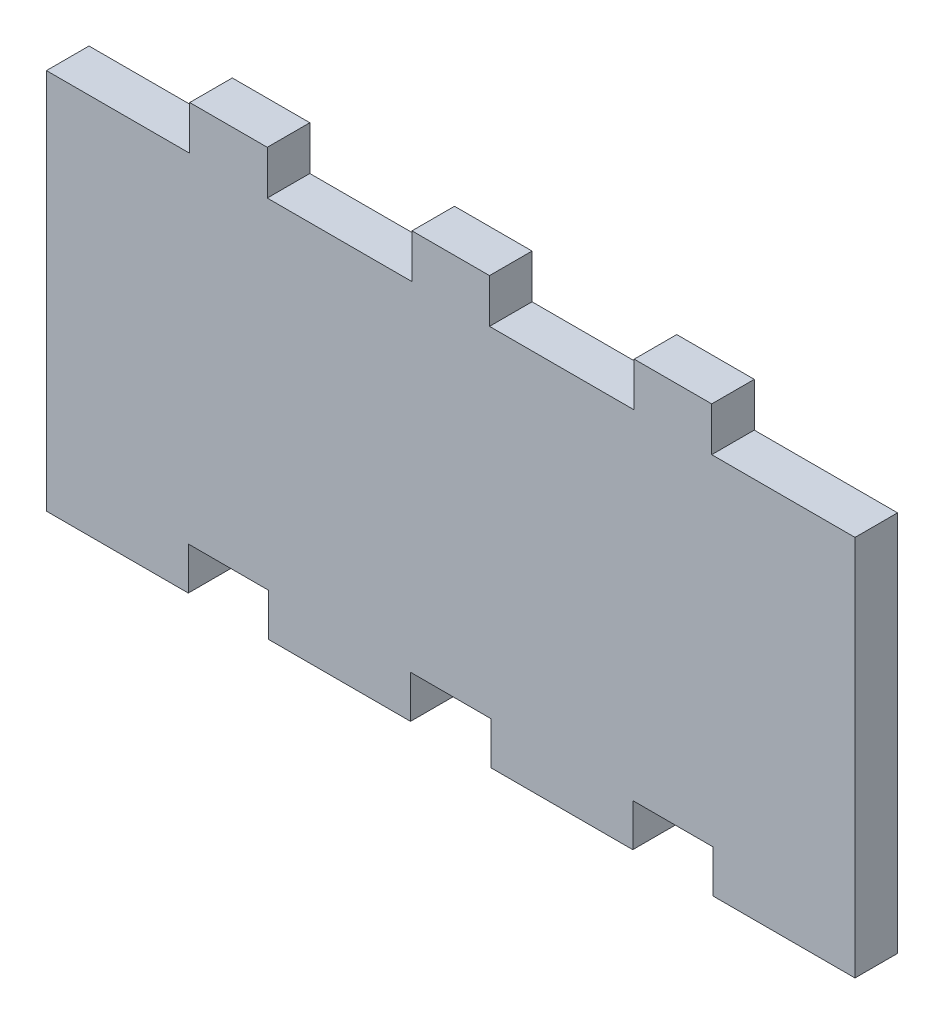
ISO-10303-21;
HEADER;
FILE_DESCRIPTION(('STEP AP214'),'2;1');
FILE_NAME('part.step','',(''),(''),'','','');
FILE_SCHEMA(('AUTOMOTIVE_DESIGN { 1 0 10303 214 1 1 1 1 }'));
ENDSEC;
DATA;
#1=APPLICATION_CONTEXT('core data for automotive mechanical design processes');
#2=APPLICATION_PROTOCOL_DEFINITION('international standard','automotive_design',2000,#1);
#3=PRODUCT_CONTEXT('',#1,'mechanical');
#4=PRODUCT('Part','Part','',(#3));
#5=PRODUCT_RELATED_PRODUCT_CATEGORY('part','',(#4));
#6=PRODUCT_DEFINITION_FORMATION('','',#4);
#7=PRODUCT_DEFINITION_CONTEXT('part definition',#1,'design');
#8=PRODUCT_DEFINITION('design','',#6,#7);
#9=PRODUCT_DEFINITION_SHAPE('','',#8);
#10=(LENGTH_UNIT() NAMED_UNIT(*) SI_UNIT(.MILLI.,.METRE.));
#11=(NAMED_UNIT(*) PLANE_ANGLE_UNIT() SI_UNIT($,.RADIAN.));
#12=(NAMED_UNIT(*) SI_UNIT($,.STERADIAN.) SOLID_ANGLE_UNIT());
#13=UNCERTAINTY_MEASURE_WITH_UNIT(LENGTH_MEASURE(1.E-05),#10,'distance_accuracy_value','');
#14=(GEOMETRIC_REPRESENTATION_CONTEXT(3) GLOBAL_UNCERTAINTY_ASSIGNED_CONTEXT((#13)) GLOBAL_UNIT_ASSIGNED_CONTEXT((#10,
#11,#12)) REPRESENTATION_CONTEXT('',''));
#15=CARTESIAN_POINT('',(0.,0.,0.));
#16=DIRECTION('',(0.,0.,1.));
#17=DIRECTION('',(1.,0.,0.));
#18=AXIS2_PLACEMENT_3D('',#15,#16,#17);
#19=CARTESIAN_POINT('',(0.,0.,-3.));
#20=DIRECTION('',(-1.,0.,0.));
#21=DIRECTION('',(0.,0.,1.));
#22=AXIS2_PLACEMENT_3D('',#19,#20,#21);
#23=PLANE('',#22);
#24=DIRECTION('',(0.,-1.,0.));
#25=VECTOR('',#24,1.);
#26=CARTESIAN_POINT('',(0.,0.,0.));
#27=LINE('',#26,#25);
#28=CARTESIAN_POINT('',(0.,23.9000000000001,0.));
#29=VERTEX_POINT('',#28);
#30=CARTESIAN_POINT('',(0.,-3.00000000000012,0.));
#31=VERTEX_POINT('',#30);
#32=EDGE_CURVE('E488',#29,#31,#27,.T.);
#33=ORIENTED_EDGE('',*,*,#32,.F.);
#34=DIRECTION('',(0.,0.,-1.));
#35=VECTOR('',#34,1.);
#36=CARTESIAN_POINT('',(0.,23.9000000000001,-3.));
#37=LINE('',#36,#35);
#38=CARTESIAN_POINT('',(0.,23.9000000000001,-3.));
#39=VERTEX_POINT('',#38);
#40=EDGE_CURVE('E277',#29,#39,#37,.T.);
#41=ORIENTED_EDGE('',*,*,#40,.T.);
#42=DIRECTION('',(0.,-1.,0.));
#43=VECTOR('',#42,1.);
#44=CARTESIAN_POINT('',(0.,0.,-3.));
#45=LINE('',#44,#43);
#46=CARTESIAN_POINT('',(0.,-3.00000000000013,-3.));
#47=VERTEX_POINT('',#46);
#48=EDGE_CURVE('E502',#39,#47,#45,.T.);
#49=ORIENTED_EDGE('',*,*,#48,.T.);
#50=DIRECTION('',(0.,0.,-1.));
#51=VECTOR('',#50,1.);
#52=CARTESIAN_POINT('',(0.,-3.00000000000012,0.));
#53=LINE('',#52,#51);
#54=EDGE_CURVE('E376',#31,#47,#53,.T.);
#55=ORIENTED_EDGE('',*,*,#54,.F.);
#56=EDGE_LOOP('',(#33,#41,#49,#55));
#57=FACE_BOUND('',#56,.T.);
#58=ADVANCED_FACE('F74',(#57),#23,.T.);
#59=CARTESIAN_POINT('',(0.,27.,-3.));
#60=DIRECTION('',(0.,1.,0.));
#61=DIRECTION('',(0.,0.,1.));
#62=AXIS2_PLACEMENT_3D('',#59,#60,#61);
#63=PLANE('',#62);
#64=DIRECTION('',(-1.,0.,0.));
#65=VECTOR('',#64,1.);
#66=CARTESIAN_POINT('',(0.,27.,0.));
#67=LINE('',#66,#65);
#68=CARTESIAN_POINT('',(46.9000000000004,27.,0.));
#69=VERTEX_POINT('',#68);
#70=CARTESIAN_POINT('',(41.4333333333337,27.,0.));
#71=VERTEX_POINT('',#70);
#72=EDGE_CURVE('E505',#69,#71,#67,.T.);
#73=ORIENTED_EDGE('',*,*,#72,.F.);
#74=DIRECTION('',(0.,0.,-1.));
#75=VECTOR('',#74,1.);
#76=CARTESIAN_POINT('',(46.9000000000004,27.,-3.));
#77=LINE('',#76,#75);
#78=CARTESIAN_POINT('',(46.9000000000004,27.,-3.));
#79=VERTEX_POINT('',#78);
#80=EDGE_CURVE('E367',#69,#79,#77,.T.);
#81=ORIENTED_EDGE('',*,*,#80,.T.);
#82=DIRECTION('',(-1.,0.,0.));
#83=VECTOR('',#82,1.);
#84=CARTESIAN_POINT('',(0.,27.,-3.));
#85=LINE('',#84,#83);
#86=CARTESIAN_POINT('',(41.4333333333337,27.,-3.));
#87=VERTEX_POINT('',#86);
#88=EDGE_CURVE('E276',#79,#87,#85,.T.);
#89=ORIENTED_EDGE('',*,*,#88,.T.);
#90=DIRECTION('',(0.,0.,1.));
#91=VECTOR('',#90,1.);
#92=CARTESIAN_POINT('',(41.4333333333337,27.,-3.));
#93=LINE('',#92,#91);
#94=EDGE_CURVE('E360',#87,#71,#93,.T.);
#95=ORIENTED_EDGE('',*,*,#94,.T.);
#96=EDGE_LOOP('',(#73,#81,#89,#95));
#97=FACE_BOUND('',#96,.T.);
#98=ADVANCED_FACE('F539',(#97),#63,.T.);
#99=CARTESIAN_POINT('',(31.2333333333337,27.,0.));
#100=VERTEX_POINT('',#99);
#101=CARTESIAN_POINT('',(25.7666666666671,27.,0.));
#102=VERTEX_POINT('',#101);
#103=EDGE_CURVE('E526',#100,#102,#67,.T.);
#104=ORIENTED_EDGE('',*,*,#103,.F.);
#105=DIRECTION('',(0.,0.,-1.));
#106=VECTOR('',#105,1.);
#107=CARTESIAN_POINT('',(31.2333333333337,27.,-3.));
#108=LINE('',#107,#106);
#109=CARTESIAN_POINT('',(31.2333333333337,27.,-3.));
#110=VERTEX_POINT('',#109);
#111=EDGE_CURVE('E363',#100,#110,#108,.T.);
#112=ORIENTED_EDGE('',*,*,#111,.T.);
#113=CARTESIAN_POINT('',(25.7666666666671,27.,-3.));
#114=VERTEX_POINT('',#113);
#115=EDGE_CURVE('E514',#110,#114,#85,.T.);
#116=ORIENTED_EDGE('',*,*,#115,.T.);
#117=DIRECTION('',(0.,0.,1.));
#118=VECTOR('',#117,1.);
#119=CARTESIAN_POINT('',(25.7666666666671,27.,-3.));
#120=LINE('',#119,#118);
#121=EDGE_CURVE('E354',#114,#102,#120,.T.);
#122=ORIENTED_EDGE('',*,*,#121,.T.);
#123=EDGE_LOOP('',(#104,#112,#116,#122));
#124=FACE_BOUND('',#123,.T.);
#125=ADVANCED_FACE('F545',(#124),#63,.T.);
#126=CARTESIAN_POINT('',(15.5666666666671,27.,0.));
#127=VERTEX_POINT('',#126);
#128=CARTESIAN_POINT('',(10.1000000000004,27.,0.));
#129=VERTEX_POINT('',#128);
#130=EDGE_CURVE('E523',#127,#129,#67,.T.);
#131=ORIENTED_EDGE('',*,*,#130,.F.);
#132=DIRECTION('',(0.,0.,-1.));
#133=VECTOR('',#132,1.);
#134=CARTESIAN_POINT('',(15.5666666666671,27.,-3.));
#135=LINE('',#134,#133);
#136=CARTESIAN_POINT('',(15.5666666666671,27.,-3.));
#137=VERTEX_POINT('',#136);
#138=EDGE_CURVE('E357',#127,#137,#135,.T.);
#139=ORIENTED_EDGE('',*,*,#138,.T.);
#140=CARTESIAN_POINT('',(10.1000000000004,27.,-3.));
#141=VERTEX_POINT('',#140);
#142=EDGE_CURVE('E511',#137,#141,#85,.T.);
#143=ORIENTED_EDGE('',*,*,#142,.T.);
#144=DIRECTION('',(0.,0.,1.));
#145=VECTOR('',#144,1.);
#146=CARTESIAN_POINT('',(10.1000000000004,27.,-3.));
#147=LINE('',#146,#145);
#148=EDGE_CURVE('E280',#141,#129,#147,.T.);
#149=ORIENTED_EDGE('',*,*,#148,.T.);
#150=EDGE_LOOP('',(#131,#139,#143,#149));
#151=FACE_BOUND('',#150,.T.);
#152=ADVANCED_FACE('F563',(#151),#63,.T.);
#153=CARTESIAN_POINT('',(57.,0.,-3.));
#154=DIRECTION('',(1.,0.,0.));
#155=DIRECTION('',(0.,0.,-1.));
#156=AXIS2_PLACEMENT_3D('',#153,#154,#155);
#157=PLANE('',#156);
#158=DIRECTION('',(0.,1.,0.));
#159=VECTOR('',#158,1.);
#160=CARTESIAN_POINT('',(57.,0.,-3.));
#161=LINE('',#160,#159);
#162=CARTESIAN_POINT('',(57.,-3.00000000000031,-3.));
#163=VERTEX_POINT('',#162);
#164=CARTESIAN_POINT('',(57.,23.8999999999999,-3.));
#165=VERTEX_POINT('',#164);
#166=EDGE_CURVE('E508',#163,#165,#161,.T.);
#167=ORIENTED_EDGE('',*,*,#166,.T.);
#168=DIRECTION('',(0.,0.,1.));
#169=VECTOR('',#168,1.);
#170=CARTESIAN_POINT('',(57.,23.8999999999999,-3.));
#171=LINE('',#170,#169);
#172=CARTESIAN_POINT('',(57.,23.8999999999999,0.));
#173=VERTEX_POINT('',#172);
#174=EDGE_CURVE('E262',#165,#173,#171,.T.);
#175=ORIENTED_EDGE('',*,*,#174,.T.);
#176=DIRECTION('',(0.,1.,0.));
#177=VECTOR('',#176,1.);
#178=CARTESIAN_POINT('',(57.,0.,0.));
#179=LINE('',#178,#177);
#180=CARTESIAN_POINT('',(57.,-3.00000000000031,0.));
#181=VERTEX_POINT('',#180);
#182=EDGE_CURVE('E519',#181,#173,#179,.T.);
#183=ORIENTED_EDGE('',*,*,#182,.F.);
#184=DIRECTION('',(0.,0.,1.));
#185=VECTOR('',#184,1.);
#186=CARTESIAN_POINT('',(57.,-3.00000000000031,-2.99999999999999));
#187=LINE('',#186,#185);
#188=EDGE_CURVE('E492',#163,#181,#187,.T.);
#189=ORIENTED_EDGE('',*,*,#188,.F.);
#190=EDGE_LOOP('',(#167,#175,#183,#189));
#191=FACE_BOUND('',#190,.T.);
#192=ADVANCED_FACE('F623',(#191),#157,.T.);
#193=CARTESIAN_POINT('',(0.,0.,-3.));
#194=DIRECTION('',(0.,0.,-1.));
#195=DIRECTION('',(-1.,0.,0.));
#196=AXIS2_PLACEMENT_3D('',#193,#194,#195);
#197=PLANE('',#196);
#198=ORIENTED_EDGE('',*,*,#88,.F.);
#199=DIRECTION('',(0.,1.,0.));
#200=VECTOR('',#199,1.);
#201=CARTESIAN_POINT('',(46.9000000000004,23.8999999999999,-3.));
#202=LINE('',#201,#200);
#203=CARTESIAN_POINT('',(46.9000000000004,23.8999999999999,-3.));
#204=VERTEX_POINT('',#203);
#205=EDGE_CURVE('E266',#204,#79,#202,.T.);
#206=ORIENTED_EDGE('',*,*,#205,.F.);
#207=DIRECTION('',(-1.,0.,0.));
#208=VECTOR('',#207,1.);
#209=CARTESIAN_POINT('',(57.1000000000004,23.8999999999999,-3.));
#210=LINE('',#209,#208);
#211=EDGE_CURVE('E257',#165,#204,#210,.T.);
#212=ORIENTED_EDGE('',*,*,#211,.F.);
#213=ORIENTED_EDGE('',*,*,#166,.F.);
#214=DIRECTION('',(1.,0.,0.));
#215=VECTOR('',#214,1.);
#216=CARTESIAN_POINT('',(47.,-3.00000000000028,-3.));
#217=LINE('',#216,#215);
#218=CARTESIAN_POINT('',(47.,-3.00000000000029,-3.));
#219=VERTEX_POINT('',#218);
#220=EDGE_CURVE('E495',#219,#163,#217,.T.);
#221=ORIENTED_EDGE('',*,*,#220,.F.);
#222=DIRECTION('',(0.,1.,0.));
#223=VECTOR('',#222,1.);
#224=CARTESIAN_POINT('',(47.,-6.0000000000006,-3.));
#225=LINE('',#224,#223);
#226=CARTESIAN_POINT('',(47.,0.,-3.));
#227=VERTEX_POINT('',#226);
#228=EDGE_CURVE('E481',#219,#227,#225,.T.);
#229=ORIENTED_EDGE('',*,*,#228,.T.);
#230=DIRECTION('',(1.,0.,0.));
#231=VECTOR('',#230,1.);
#232=CARTESIAN_POINT('',(0.,0.,-3.));
#233=LINE('',#232,#231);
#234=CARTESIAN_POINT('',(41.3333333333333,0.,-3.));
#235=VERTEX_POINT('',#234);
#236=EDGE_CURVE('E504',#235,#227,#233,.T.);
#237=ORIENTED_EDGE('',*,*,#236,.F.);
#238=DIRECTION('',(0.,1.,0.));
#239=VECTOR('',#238,1.);
#240=CARTESIAN_POINT('',(41.3333333333333,-6.00000000000049,-3.));
#241=LINE('',#240,#239);
#242=CARTESIAN_POINT('',(41.3333333333333,-3.00000000000026,-3.));
#243=VERTEX_POINT('',#242);
#244=EDGE_CURVE('E418',#243,#235,#241,.T.);
#245=ORIENTED_EDGE('',*,*,#244,.F.);
#246=DIRECTION('',(1.,0.,0.));
#247=VECTOR('',#246,1.);
#248=CARTESIAN_POINT('',(31.3333333333333,-3.00000000000022,-3.));
#249=LINE('',#248,#247);
#250=CARTESIAN_POINT('',(31.3333333333333,-3.00000000000024,-3.));
#251=VERTEX_POINT('',#250);
#252=EDGE_CURVE('E465',#251,#243,#249,.T.);
#253=ORIENTED_EDGE('',*,*,#252,.F.);
#254=DIRECTION('',(0.,1.,0.));
#255=VECTOR('',#254,1.);
#256=CARTESIAN_POINT('',(31.3333333333333,-6.00000000000049,-3.));
#257=LINE('',#256,#255);
#258=CARTESIAN_POINT('',(31.3333333333333,0.,-3.));
#259=VERTEX_POINT('',#258);
#260=EDGE_CURVE('E441',#251,#259,#257,.T.);
#261=ORIENTED_EDGE('',*,*,#260,.T.);
#262=CARTESIAN_POINT('',(25.6666666666667,0.,-3.));
#263=VERTEX_POINT('',#262);
#264=EDGE_CURVE('E509',#263,#259,#233,.T.);
#265=ORIENTED_EDGE('',*,*,#264,.F.);
#266=DIRECTION('',(0.,1.,0.));
#267=VECTOR('',#266,1.);
#268=CARTESIAN_POINT('',(25.6666666666667,-6.00000000000038,-3.));
#269=LINE('',#268,#267);
#270=CARTESIAN_POINT('',(25.6666666666667,-3.0000000000002,-3.));
#271=VERTEX_POINT('',#270);
#272=EDGE_CURVE('E382',#271,#263,#269,.T.);
#273=ORIENTED_EDGE('',*,*,#272,.F.);
#274=DIRECTION('',(1.,0.,0.));
#275=VECTOR('',#274,1.);
#276=CARTESIAN_POINT('',(15.6666666666667,-3.00000000000017,-3.));
#277=LINE('',#276,#275);
#278=CARTESIAN_POINT('',(15.6666666666667,-3.00000000000019,-3.));
#279=VERTEX_POINT('',#278);
#280=EDGE_CURVE('E425',#279,#271,#277,.T.);
#281=ORIENTED_EDGE('',*,*,#280,.F.);
#282=DIRECTION('',(0.,1.,0.));
#283=VECTOR('',#282,1.);
#284=CARTESIAN_POINT('',(15.6666666666667,-6.00000000000038,-3.));
#285=LINE('',#284,#283);
#286=CARTESIAN_POINT('',(15.6666666666667,0.,-3.));
#287=VERTEX_POINT('',#286);
#288=EDGE_CURVE('E401',#279,#287,#285,.T.);
#289=ORIENTED_EDGE('',*,*,#288,.T.);
#290=CARTESIAN_POINT('',(10.,0.,-3.));
#291=VERTEX_POINT('',#290);
#292=EDGE_CURVE('E506',#291,#287,#233,.T.);
#293=ORIENTED_EDGE('',*,*,#292,.F.);
#294=DIRECTION('',(0.,1.,0.));
#295=VECTOR('',#294,1.);
#296=CARTESIAN_POINT('',(10.,-6.00000000000027,-3.));
#297=LINE('',#296,#295);
#298=CARTESIAN_POINT('',(10.,-3.00000000000015,-3.));
#299=VERTEX_POINT('',#298);
#300=EDGE_CURVE('E369',#299,#291,#297,.T.);
#301=ORIENTED_EDGE('',*,*,#300,.F.);
#302=DIRECTION('',(1.,0.,0.));
#303=VECTOR('',#302,1.);
#304=CARTESIAN_POINT('',(0.,-3.00000000000011,-3.));
#305=LINE('',#304,#303);
#306=EDGE_CURVE('E389',#47,#299,#305,.T.);
#307=ORIENTED_EDGE('',*,*,#306,.F.);
#308=ORIENTED_EDGE('',*,*,#48,.F.);
#309=DIRECTION('',(-1.,0.,0.));
#310=VECTOR('',#309,1.);
#311=CARTESIAN_POINT('',(10.1000000000004,23.9000000000001,-3.));
#312=LINE('',#311,#310);
#313=CARTESIAN_POINT('',(10.1000000000004,23.9000000000001,-3.));
#314=VERTEX_POINT('',#313);
#315=EDGE_CURVE('E344',#314,#39,#312,.T.);
#316=ORIENTED_EDGE('',*,*,#315,.F.);
#317=DIRECTION('',(0.,-1.,0.));
#318=VECTOR('',#317,1.);
#319=CARTESIAN_POINT('',(10.1000000000004,27.1000000000001,-3.));
#320=LINE('',#319,#318);
#321=EDGE_CURVE('E338',#141,#314,#320,.T.);
#322=ORIENTED_EDGE('',*,*,#321,.F.);
#323=ORIENTED_EDGE('',*,*,#142,.F.);
#324=DIRECTION('',(0.,1.,0.));
#325=VECTOR('',#324,1.);
#326=CARTESIAN_POINT('',(15.5666666666671,23.9000000000001,-3.));
#327=LINE('',#326,#325);
#328=CARTESIAN_POINT('',(15.5666666666671,23.9000000000001,-3.));
#329=VERTEX_POINT('',#328);
#330=EDGE_CURVE('E331',#329,#137,#327,.T.);
#331=ORIENTED_EDGE('',*,*,#330,.F.);
#332=DIRECTION('',(-1.,0.,0.));
#333=VECTOR('',#332,1.);
#334=CARTESIAN_POINT('',(25.7666666666671,23.9,-3.));
#335=LINE('',#334,#333);
#336=CARTESIAN_POINT('',(25.7666666666671,23.9,-3.));
#337=VERTEX_POINT('',#336);
#338=EDGE_CURVE('E316',#337,#329,#335,.T.);
#339=ORIENTED_EDGE('',*,*,#338,.F.);
#340=DIRECTION('',(0.,-1.,0.));
#341=VECTOR('',#340,1.);
#342=CARTESIAN_POINT('',(25.7666666666671,27.1,-3.));
#343=LINE('',#342,#341);
#344=EDGE_CURVE('E310',#114,#337,#343,.T.);
#345=ORIENTED_EDGE('',*,*,#344,.F.);
#346=ORIENTED_EDGE('',*,*,#115,.F.);
#347=DIRECTION('',(0.,1.,0.));
#348=VECTOR('',#347,1.);
#349=CARTESIAN_POINT('',(31.2333333333337,23.9,-3.));
#350=LINE('',#349,#348);
#351=CARTESIAN_POINT('',(31.2333333333337,23.9,-3.));
#352=VERTEX_POINT('',#351);
#353=EDGE_CURVE('E304',#352,#110,#350,.T.);
#354=ORIENTED_EDGE('',*,*,#353,.F.);
#355=DIRECTION('',(-1.,0.,0.));
#356=VECTOR('',#355,1.);
#357=CARTESIAN_POINT('',(41.4333333333337,23.9,-3.));
#358=LINE('',#357,#356);
#359=CARTESIAN_POINT('',(41.4333333333337,23.9,-3.));
#360=VERTEX_POINT('',#359);
#361=EDGE_CURVE('E291',#360,#352,#358,.T.);
#362=ORIENTED_EDGE('',*,*,#361,.F.);
#363=DIRECTION('',(0.,-1.,0.));
#364=VECTOR('',#363,1.);
#365=CARTESIAN_POINT('',(41.4333333333337,27.1,-3.));
#366=LINE('',#365,#364);
#367=EDGE_CURVE('E270',#87,#360,#366,.T.);
#368=ORIENTED_EDGE('',*,*,#367,.F.);
#369=EDGE_LOOP('',(#198,#206,#212,#213,#221,#229,#237,#245,#253,#261,#265,#273,#281,#289,#293,
#301,#307,#308,#316,#322,#323,#331,#339,#345,#346,#354,#362,#368));
#370=FACE_BOUND('',#369,.T.);
#371=ADVANCED_FACE('F273',(#370),#197,.T.);
#372=CARTESIAN_POINT('',(0.,0.,0.));
#373=DIRECTION('',(0.,0.,-1.));
#374=DIRECTION('',(-1.,0.,0.));
#375=AXIS2_PLACEMENT_3D('',#372,#373,#374);
#376=PLANE('',#375);
#377=CARTESIAN_POINT('',(46.9000000000004,23.8999999999999,0.));
#378=CARTESIAN_POINT('',(46.9000000000004,27.0999999999999,0.));
#379=B_SPLINE_CURVE_WITH_KNOTS('',1,(#377,#378),.UNSPECIFIED.,.F.,.F.,(2,2),(0.,
0.119402985074627),.UNSPECIFIED.);
#380=CARTESIAN_POINT('',(46.9000000000004,23.8999999999999,0.));
#381=VERTEX_POINT('',#380);
#382=EDGE_CURVE('E88',#381,#69,#379,.T.);
#383=ORIENTED_EDGE('',*,*,#382,.T.);
#384=ORIENTED_EDGE('',*,*,#72,.T.);
#385=DIRECTION('',(0.,1.,0.));
#386=VECTOR('',#385,1.);
#387=CARTESIAN_POINT('',(41.4333333333337,-1.44663710139402E-13,0.));
#388=LINE('',#387,#386);
#389=CARTESIAN_POINT('',(41.4333333333337,23.9,0.));
#390=VERTEX_POINT('',#389);
#391=EDGE_CURVE('E81',#390,#71,#388,.T.);
#392=ORIENTED_EDGE('',*,*,#391,.F.);
#393=CARTESIAN_POINT('',(41.4333333333337,23.9,0.));
#394=CARTESIAN_POINT('',(31.2333333333337,23.9,0.));
#395=B_SPLINE_CURVE_WITH_KNOTS('',1,(#393,#394),.UNSPECIFIED.,.F.,.F.,(2,2),(0.619402985074627,
1.),.UNSPECIFIED.);
#396=CARTESIAN_POINT('',(31.2333333333337,23.9,0.));
#397=VERTEX_POINT('',#396);
#398=EDGE_CURVE('E286',#390,#397,#395,.T.);
#399=ORIENTED_EDGE('',*,*,#398,.T.);
#400=CARTESIAN_POINT('',(31.2333333333337,23.9,0.));
#401=CARTESIAN_POINT('',(31.2333333333337,27.1,0.));
#402=B_SPLINE_CURVE_WITH_KNOTS('',1,(#400,#401),.UNSPECIFIED.,.F.,.F.,(2,2),(0.,
0.119402985074627),.UNSPECIFIED.);
#403=EDGE_CURVE('E96',#397,#100,#402,.T.);
#404=ORIENTED_EDGE('',*,*,#403,.T.);
#405=ORIENTED_EDGE('',*,*,#103,.T.);
#406=DIRECTION('',(0.,1.,0.));
#407=VECTOR('',#406,1.);
#408=CARTESIAN_POINT('',(25.766666666667,0.,0.));
#409=LINE('',#408,#407);
#410=CARTESIAN_POINT('',(25.7666666666671,23.9,0.));
#411=VERTEX_POINT('',#410);
#412=EDGE_CURVE('E529',#411,#102,#409,.T.);
#413=ORIENTED_EDGE('',*,*,#412,.F.);
#414=CARTESIAN_POINT('',(25.7666666666671,23.9,0.));
#415=CARTESIAN_POINT('',(15.5666666666671,23.9000000000001,0.));
#416=B_SPLINE_CURVE_WITH_KNOTS('',1,(#414,#415),.UNSPECIFIED.,.F.,.F.,(2,2),(0.619402985074627,
1.),.UNSPECIFIED.);
#417=CARTESIAN_POINT('',(15.5666666666671,23.9000000000001,0.));
#418=VERTEX_POINT('',#417);
#419=EDGE_CURVE('E311',#411,#418,#416,.T.);
#420=ORIENTED_EDGE('',*,*,#419,.T.);
#421=CARTESIAN_POINT('',(15.5666666666671,23.9000000000001,0.));
#422=CARTESIAN_POINT('',(15.5666666666671,27.1000000000001,0.));
#423=B_SPLINE_CURVE_WITH_KNOTS('',1,(#421,#422),.UNSPECIFIED.,.F.,.F.,(2,2),(0.,
0.119402985074627),.UNSPECIFIED.);
#424=EDGE_CURVE('E318',#418,#127,#423,.T.);
#425=ORIENTED_EDGE('',*,*,#424,.T.);
#426=ORIENTED_EDGE('',*,*,#130,.T.);
#427=DIRECTION('',(0.,1.,0.));
#428=VECTOR('',#427,1.);
#429=CARTESIAN_POINT('',(10.1000000000003,0.,0.));
#430=LINE('',#429,#428);
#431=CARTESIAN_POINT('',(10.1000000000004,23.9000000000001,0.));
#432=VERTEX_POINT('',#431);
#433=EDGE_CURVE('E527',#432,#129,#430,.T.);
#434=ORIENTED_EDGE('',*,*,#433,.F.);
#435=CARTESIAN_POINT('',(10.1000000000004,23.9000000000001,0.));
#436=CARTESIAN_POINT('',(-0.0999999999995865,23.9000000000001,0.));
#437=B_SPLINE_CURVE_WITH_KNOTS('',1,(#435,#436),.UNSPECIFIED.,.F.,.F.,(2,2),(0.619402985074627,
1.),.UNSPECIFIED.);
#438=EDGE_CURVE('E339',#432,#29,#437,.T.);
#439=ORIENTED_EDGE('',*,*,#438,.T.);
#440=ORIENTED_EDGE('',*,*,#32,.T.);
#441=DIRECTION('',(-1.,0.,0.));
#442=VECTOR('',#441,1.);
#443=CARTESIAN_POINT('',(10.,-3.00000000000016,0.));
#444=LINE('',#443,#442);
#445=CARTESIAN_POINT('',(10.,-3.00000000000014,0.));
#446=VERTEX_POINT('',#445);
#447=EDGE_CURVE('E383',#446,#31,#444,.T.);
#448=ORIENTED_EDGE('',*,*,#447,.F.);
#449=DIRECTION('',(0.,1.,0.));
#450=VECTOR('',#449,1.);
#451=CARTESIAN_POINT('',(10.,-6.00000000000027,0.));
#452=LINE('',#451,#450);
#453=CARTESIAN_POINT('',(10.,0.,0.));
#454=VERTEX_POINT('',#453);
#455=EDGE_CURVE('E375',#446,#454,#452,.T.);
#456=ORIENTED_EDGE('',*,*,#455,.T.);
#457=DIRECTION('',(1.,0.,0.));
#458=VECTOR('',#457,1.);
#459=CARTESIAN_POINT('',(0.,0.,0.));
#460=LINE('',#459,#458);
#461=CARTESIAN_POINT('',(15.6666666666667,0.,0.));
#462=VERTEX_POINT('',#461);
#463=EDGE_CURVE('E517',#454,#462,#460,.T.);
#464=ORIENTED_EDGE('',*,*,#463,.T.);
#465=DIRECTION('',(0.,1.,0.));
#466=VECTOR('',#465,1.);
#467=CARTESIAN_POINT('',(15.6666666666667,-6.00000000000038,0.));
#468=LINE('',#467,#466);
#469=CARTESIAN_POINT('',(15.6666666666667,-3.00000000000017,0.));
#470=VERTEX_POINT('',#469);
#471=EDGE_CURVE('E402',#470,#462,#468,.T.);
#472=ORIENTED_EDGE('',*,*,#471,.F.);
#473=DIRECTION('',(-1.,0.,0.));
#474=VECTOR('',#473,1.);
#475=CARTESIAN_POINT('',(25.6666666666667,-3.00000000000021,0.));
#476=LINE('',#475,#474);
#477=CARTESIAN_POINT('',(25.6666666666667,-3.0000000000002,0.));
#478=VERTEX_POINT('',#477);
#479=EDGE_CURVE('E419',#478,#470,#476,.T.);
#480=ORIENTED_EDGE('',*,*,#479,.F.);
#481=DIRECTION('',(0.,1.,0.));
#482=VECTOR('',#481,1.);
#483=CARTESIAN_POINT('',(25.6666666666667,-6.00000000000038,0.));
#484=LINE('',#483,#482);
#485=CARTESIAN_POINT('',(25.6666666666667,0.,0.));
#486=VERTEX_POINT('',#485);
#487=EDGE_CURVE('E411',#478,#486,#484,.T.);
#488=ORIENTED_EDGE('',*,*,#487,.T.);
#489=CARTESIAN_POINT('',(31.3333333333333,0.,0.));
#490=VERTEX_POINT('',#489);
#491=EDGE_CURVE('E520',#486,#490,#460,.T.);
#492=ORIENTED_EDGE('',*,*,#491,.T.);
#493=DIRECTION('',(0.,1.,0.));
#494=VECTOR('',#493,1.);
#495=CARTESIAN_POINT('',(31.3333333333333,-6.00000000000049,0.));
#496=LINE('',#495,#494);
#497=CARTESIAN_POINT('',(31.3333333333333,-3.00000000000023,0.));
#498=VERTEX_POINT('',#497);
#499=EDGE_CURVE('E442',#498,#490,#496,.T.);
#500=ORIENTED_EDGE('',*,*,#499,.F.);
#501=DIRECTION('',(-1.,0.,0.));
#502=VECTOR('',#501,1.);
#503=CARTESIAN_POINT('',(41.3333333333333,-3.00000000000027,0.));
#504=LINE('',#503,#502);
#505=CARTESIAN_POINT('',(41.3333333333333,-3.00000000000025,0.));
#506=VERTEX_POINT('',#505);
#507=EDGE_CURVE('E459',#506,#498,#504,.T.);
#508=ORIENTED_EDGE('',*,*,#507,.F.);
#509=DIRECTION('',(0.,1.,0.));
#510=VECTOR('',#509,1.);
#511=CARTESIAN_POINT('',(41.3333333333333,-6.00000000000049,0.));
#512=LINE('',#511,#510);
#513=CARTESIAN_POINT('',(41.3333333333333,0.,0.));
#514=VERTEX_POINT('',#513);
#515=EDGE_CURVE('E451',#506,#514,#512,.T.);
#516=ORIENTED_EDGE('',*,*,#515,.T.);
#517=CARTESIAN_POINT('',(47.,0.,0.));
#518=VERTEX_POINT('',#517);
#519=EDGE_CURVE('E516',#514,#518,#460,.T.);
#520=ORIENTED_EDGE('',*,*,#519,.T.);
#521=DIRECTION('',(0.,1.,0.));
#522=VECTOR('',#521,1.);
#523=CARTESIAN_POINT('',(47.,-6.0000000000006,0.));
#524=LINE('',#523,#522);
#525=CARTESIAN_POINT('',(47.,-3.00000000000028,0.));
#526=VERTEX_POINT('',#525);
#527=EDGE_CURVE('E458',#526,#518,#524,.T.);
#528=ORIENTED_EDGE('',*,*,#527,.F.);
#529=DIRECTION('',(-1.,0.,0.));
#530=VECTOR('',#529,1.);
#531=CARTESIAN_POINT('',(57.,-3.00000000000032,0.));
#532=LINE('',#531,#530);
#533=EDGE_CURVE('E489',#181,#526,#532,.T.);
#534=ORIENTED_EDGE('',*,*,#533,.F.);
#535=ORIENTED_EDGE('',*,*,#182,.T.);
#536=DIRECTION('',(1.,0.,0.));
#537=VECTOR('',#536,1.);
#538=CARTESIAN_POINT('',(0.,23.9000000000001,0.));
#539=LINE('',#538,#537);
#540=EDGE_CURVE('E13',#381,#173,#539,.T.);
#541=ORIENTED_EDGE('',*,*,#540,.F.);
#542=EDGE_LOOP('',(#383,#384,#392,#399,#404,#405,#413,#420,#425,#426,#434,#439,#440,#448,#456,
#464,#472,#480,#488,#492,#500,#508,#516,#520,#528,#534,#535,#541));
#543=FACE_BOUND('',#542,.T.);
#544=ADVANCED_FACE('F540',(#543),#376,.F.);
#545=CARTESIAN_POINT('',(0.,0.,-3.));
#546=DIRECTION('',(0.,-1.,0.));
#547=DIRECTION('',(0.,0.,-1.));
#548=AXIS2_PLACEMENT_3D('',#545,#546,#547);
#549=PLANE('',#548);
#550=CARTESIAN_POINT('',(25.6666666666667,0.,-3.));
#551=CARTESIAN_POINT('',(25.6666666666667,0.,0.));
#552=B_SPLINE_CURVE_WITH_KNOTS('',1,(#550,#551),.UNSPECIFIED.,.F.,.F.,(2,2),(0.,
0.115384615384615),.UNSPECIFIED.);
#553=EDGE_CURVE('E403',#263,#486,#552,.T.);
#554=ORIENTED_EDGE('',*,*,#553,.F.);
#555=ORIENTED_EDGE('',*,*,#264,.T.);
#556=CARTESIAN_POINT('',(31.3333333333333,0.,0.));
#557=CARTESIAN_POINT('',(31.3333333333333,0.,-3.));
#558=B_SPLINE_CURVE_WITH_KNOTS('',1,(#556,#557),.UNSPECIFIED.,.F.,.F.,(2,2),(0.5,
0.615384615384615),.UNSPECIFIED.);
#559=EDGE_CURVE('E436',#490,#259,#558,.T.);
#560=ORIENTED_EDGE('',*,*,#559,.F.);
#561=ORIENTED_EDGE('',*,*,#491,.F.);
#562=EDGE_LOOP('',(#554,#555,#560,#561));
#563=FACE_BOUND('',#562,.T.);
#564=ADVANCED_FACE('F599',(#563),#549,.T.);
#565=CARTESIAN_POINT('',(41.3333333333333,0.,-3.));
#566=CARTESIAN_POINT('',(41.3333333333333,0.,0.));
#567=B_SPLINE_CURVE_WITH_KNOTS('',1,(#565,#566),.UNSPECIFIED.,.F.,.F.,(2,2),(0.,
0.115384615384615),.UNSPECIFIED.);
#568=EDGE_CURVE('E443',#235,#514,#567,.T.);
#569=ORIENTED_EDGE('',*,*,#568,.F.);
#570=ORIENTED_EDGE('',*,*,#236,.T.);
#571=CARTESIAN_POINT('',(47.,0.,0.));
#572=CARTESIAN_POINT('',(47.,0.,-3.));
#573=B_SPLINE_CURVE_WITH_KNOTS('',1,(#571,#572),.UNSPECIFIED.,.F.,.F.,(2,2),(0.5,
0.615384615384615),.UNSPECIFIED.);
#574=EDGE_CURVE('E476',#518,#227,#573,.T.);
#575=ORIENTED_EDGE('',*,*,#574,.F.);
#576=ORIENTED_EDGE('',*,*,#519,.F.);
#577=EDGE_LOOP('',(#569,#570,#575,#576));
#578=FACE_BOUND('',#577,.T.);
#579=ADVANCED_FACE('F612',(#578),#549,.T.);
#580=CARTESIAN_POINT('',(10.,0.,-3.));
#581=CARTESIAN_POINT('',(10.,0.,0.));
#582=B_SPLINE_CURVE_WITH_KNOTS('',1,(#580,#581),.UNSPECIFIED.,.F.,.F.,(2,2),(0.,
0.115384615384615),.UNSPECIFIED.);
#583=EDGE_CURVE('E370',#291,#454,#582,.T.);
#584=ORIENTED_EDGE('',*,*,#583,.F.);
#585=ORIENTED_EDGE('',*,*,#292,.T.);
#586=CARTESIAN_POINT('',(15.6666666666667,0.,0.));
#587=CARTESIAN_POINT('',(15.6666666666667,0.,-3.));
#588=B_SPLINE_CURVE_WITH_KNOTS('',1,(#586,#587),.UNSPECIFIED.,.F.,.F.,(2,2),(0.5,
0.615384615384615),.UNSPECIFIED.);
#589=EDGE_CURVE('E396',#462,#287,#588,.T.);
#590=ORIENTED_EDGE('',*,*,#589,.F.);
#591=ORIENTED_EDGE('',*,*,#463,.F.);
#592=EDGE_LOOP('',(#584,#585,#590,#591));
#593=FACE_BOUND('',#592,.T.);
#594=ADVANCED_FACE('F587',(#593),#549,.T.);
#595=CARTESIAN_POINT('',(47.,-6.0000000000006,0.));
#596=DIRECTION('',(1.,0.,0.));
#597=DIRECTION('',(0.,0.,-1.));
#598=AXIS2_PLACEMENT_3D('',#595,#596,#597);
#599=PLANE('',#598);
#600=DIRECTION('',(0.,0.,-1.));
#601=VECTOR('',#600,1.);
#602=CARTESIAN_POINT('',(47.,-3.00000000000029,0.));
#603=LINE('',#602,#601);
#604=EDGE_CURVE('E482',#526,#219,#603,.T.);
#605=ORIENTED_EDGE('',*,*,#604,.F.);
#606=ORIENTED_EDGE('',*,*,#527,.T.);
#607=ORIENTED_EDGE('',*,*,#574,.T.);
#608=ORIENTED_EDGE('',*,*,#228,.F.);
#609=EDGE_LOOP('',(#605,#606,#607,#608));
#610=FACE_BOUND('',#609,.T.);
#611=ADVANCED_FACE('F616',(#610),#599,.F.);
#612=CARTESIAN_POINT('',(60.0000000000007,-3.00000000000033,0.));
#613=DIRECTION('',(0.,-1.,0.));
#614=DIRECTION('',(0.,0.,1.));
#615=AXIS2_PLACEMENT_3D('',#612,#613,#614);
#616=PLANE('',#615);
#617=ORIENTED_EDGE('',*,*,#220,.T.);
#618=ORIENTED_EDGE('',*,*,#188,.T.);
#619=ORIENTED_EDGE('',*,*,#533,.T.);
#620=ORIENTED_EDGE('',*,*,#604,.T.);
#621=EDGE_LOOP('',(#617,#618,#619,#620));
#622=FACE_BOUND('',#621,.T.);
#623=ADVANCED_FACE('F620',(#622),#616,.T.);
#624=CARTESIAN_POINT('',(41.3333333333333,-6.00000000000049,-3.));
#625=DIRECTION('',(-1.,0.,0.));
#626=DIRECTION('',(0.,0.,1.));
#627=AXIS2_PLACEMENT_3D('',#624,#625,#626);
#628=PLANE('',#627);
#629=DIRECTION('',(0.,0.,1.));
#630=VECTOR('',#629,1.);
#631=CARTESIAN_POINT('',(41.3333333333333,-3.00000000000026,-2.99999999999999));
#632=LINE('',#631,#630);
#633=EDGE_CURVE('E462',#243,#506,#632,.T.);
#634=ORIENTED_EDGE('',*,*,#633,.F.);
#635=ORIENTED_EDGE('',*,*,#244,.T.);
#636=ORIENTED_EDGE('',*,*,#568,.T.);
#637=ORIENTED_EDGE('',*,*,#515,.F.);
#638=EDGE_LOOP('',(#634,#635,#636,#637));
#639=FACE_BOUND('',#638,.T.);
#640=ADVANCED_FACE('F609',(#639),#628,.F.);
#641=CARTESIAN_POINT('',(31.3333333333333,-6.00000000000049,0.));
#642=DIRECTION('',(1.,0.,0.));
#643=DIRECTION('',(0.,0.,-1.));
#644=AXIS2_PLACEMENT_3D('',#641,#642,#643);
#645=PLANE('',#644);
#646=DIRECTION('',(0.,0.,-1.));
#647=VECTOR('',#646,1.);
#648=CARTESIAN_POINT('',(31.3333333333333,-3.00000000000023,0.));
#649=LINE('',#648,#647);
#650=EDGE_CURVE('E452',#498,#251,#649,.T.);
#651=ORIENTED_EDGE('',*,*,#650,.F.);
#652=ORIENTED_EDGE('',*,*,#499,.T.);
#653=ORIENTED_EDGE('',*,*,#559,.T.);
#654=ORIENTED_EDGE('',*,*,#260,.F.);
#655=EDGE_LOOP('',(#651,#652,#653,#654));
#656=FACE_BOUND('',#655,.T.);
#657=ADVANCED_FACE('F602',(#656),#645,.F.);
#658=CARTESIAN_POINT('',(60.0000000000007,-3.00000000000033,0.));
#659=DIRECTION('',(0.,-1.,0.));
#660=DIRECTION('',(0.,0.,1.));
#661=AXIS2_PLACEMENT_3D('',#658,#659,#660);
#662=PLANE('',#661);
#663=ORIENTED_EDGE('',*,*,#252,.T.);
#664=ORIENTED_EDGE('',*,*,#633,.T.);
#665=ORIENTED_EDGE('',*,*,#507,.T.);
#666=ORIENTED_EDGE('',*,*,#650,.T.);
#667=EDGE_LOOP('',(#663,#664,#665,#666));
#668=FACE_BOUND('',#667,.T.);
#669=ADVANCED_FACE('F605',(#668),#662,.T.);
#670=CARTESIAN_POINT('',(25.6666666666667,-6.00000000000038,-3.));
#671=DIRECTION('',(-1.,0.,0.));
#672=DIRECTION('',(0.,0.,1.));
#673=AXIS2_PLACEMENT_3D('',#670,#671,#672);
#674=PLANE('',#673);
#675=DIRECTION('',(0.,0.,1.));
#676=VECTOR('',#675,1.);
#677=CARTESIAN_POINT('',(25.6666666666667,-3.0000000000002,-2.99999999999999));
#678=LINE('',#677,#676);
#679=EDGE_CURVE('E422',#271,#478,#678,.T.);
#680=ORIENTED_EDGE('',*,*,#679,.F.);
#681=ORIENTED_EDGE('',*,*,#272,.T.);
#682=ORIENTED_EDGE('',*,*,#553,.T.);
#683=ORIENTED_EDGE('',*,*,#487,.F.);
#684=EDGE_LOOP('',(#680,#681,#682,#683));
#685=FACE_BOUND('',#684,.T.);
#686=ADVANCED_FACE('F595',(#685),#674,.F.);
#687=CARTESIAN_POINT('',(15.6666666666667,-6.00000000000038,0.));
#688=DIRECTION('',(1.,0.,0.));
#689=DIRECTION('',(0.,0.,-1.));
#690=AXIS2_PLACEMENT_3D('',#687,#688,#689);
#691=PLANE('',#690);
#692=DIRECTION('',(0.,0.,-1.));
#693=VECTOR('',#692,1.);
#694=CARTESIAN_POINT('',(15.6666666666667,-3.00000000000018,0.));
#695=LINE('',#694,#693);
#696=EDGE_CURVE('E412',#470,#279,#695,.T.);
#697=ORIENTED_EDGE('',*,*,#696,.F.);
#698=ORIENTED_EDGE('',*,*,#471,.T.);
#699=ORIENTED_EDGE('',*,*,#589,.T.);
#700=ORIENTED_EDGE('',*,*,#288,.F.);
#701=EDGE_LOOP('',(#697,#698,#699,#700));
#702=FACE_BOUND('',#701,.T.);
#703=ADVANCED_FACE('F654',(#702),#691,.F.);
#704=CARTESIAN_POINT('',(60.0000000000007,-3.00000000000033,0.));
#705=DIRECTION('',(0.,-1.,0.));
#706=DIRECTION('',(0.,0.,1.));
#707=AXIS2_PLACEMENT_3D('',#704,#705,#706);
#708=PLANE('',#707);
#709=ORIENTED_EDGE('',*,*,#280,.T.);
#710=ORIENTED_EDGE('',*,*,#679,.T.);
#711=ORIENTED_EDGE('',*,*,#479,.T.);
#712=ORIENTED_EDGE('',*,*,#696,.T.);
#713=EDGE_LOOP('',(#709,#710,#711,#712));
#714=FACE_BOUND('',#713,.T.);
#715=ADVANCED_FACE('F592',(#714),#708,.T.);
#716=CARTESIAN_POINT('',(10.,-6.00000000000027,-3.));
#717=DIRECTION('',(-1.,0.,0.));
#718=DIRECTION('',(0.,0.,1.));
#719=AXIS2_PLACEMENT_3D('',#716,#717,#718);
#720=PLANE('',#719);
#721=DIRECTION('',(0.,0.,1.));
#722=VECTOR('',#721,1.);
#723=CARTESIAN_POINT('',(10.,-3.00000000000015,-2.99999999999999));
#724=LINE('',#723,#722);
#725=EDGE_CURVE('E386',#299,#446,#724,.T.);
#726=ORIENTED_EDGE('',*,*,#725,.F.);
#727=ORIENTED_EDGE('',*,*,#300,.T.);
#728=ORIENTED_EDGE('',*,*,#583,.T.);
#729=ORIENTED_EDGE('',*,*,#455,.F.);
#730=EDGE_LOOP('',(#726,#727,#728,#729));
#731=FACE_BOUND('',#730,.T.);
#732=ADVANCED_FACE('F581',(#731),#720,.F.);
#733=CARTESIAN_POINT('',(60.0000000000007,-3.00000000000033,0.));
#734=DIRECTION('',(0.,-1.,0.));
#735=DIRECTION('',(0.,0.,1.));
#736=AXIS2_PLACEMENT_3D('',#733,#734,#735);
#737=PLANE('',#736);
#738=ORIENTED_EDGE('',*,*,#306,.T.);
#739=ORIENTED_EDGE('',*,*,#725,.T.);
#740=ORIENTED_EDGE('',*,*,#447,.T.);
#741=ORIENTED_EDGE('',*,*,#54,.T.);
#742=EDGE_LOOP('',(#738,#739,#740,#741));
#743=FACE_BOUND('',#742,.T.);
#744=ADVANCED_FACE('F582',(#743),#737,.T.);
#745=CARTESIAN_POINT('',(10.1000000000004,27.1000000000001,-5.99999999999998));
#746=DIRECTION('',(-1.,0.,0.));
#747=DIRECTION('',(0.,1.,0.));
#748=AXIS2_PLACEMENT_3D('',#745,#746,#747);
#749=PLANE('',#748);
#750=ORIENTED_EDGE('',*,*,#321,.T.);
#751=DIRECTION('',(0.,0.,1.));
#752=VECTOR('',#751,1.);
#753=CARTESIAN_POINT('',(10.1000000000004,23.9000000000001,-5.99999999999998));
#754=LINE('',#753,#752);
#755=EDGE_CURVE('E345',#314,#432,#754,.T.);
#756=ORIENTED_EDGE('',*,*,#755,.T.);
#757=ORIENTED_EDGE('',*,*,#433,.T.);
#758=ORIENTED_EDGE('',*,*,#148,.F.);
#759=EDGE_LOOP('',(#750,#756,#757,#758));
#760=FACE_BOUND('',#759,.T.);
#761=ADVANCED_FACE('F566',(#760),#749,.T.);
#762=CARTESIAN_POINT('',(10.1000000000004,23.9000000000001,-5.99999999999998));
#763=DIRECTION('',(0.,1.,0.));
#764=DIRECTION('',(0.,0.,-1.));
#765=AXIS2_PLACEMENT_3D('',#762,#763,#764);
#766=PLANE('',#765);
#767=ORIENTED_EDGE('',*,*,#438,.F.);
#768=ORIENTED_EDGE('',*,*,#755,.F.);
#769=ORIENTED_EDGE('',*,*,#315,.T.);
#770=ORIENTED_EDGE('',*,*,#40,.F.);
#771=EDGE_LOOP('',(#767,#768,#769,#770));
#772=FACE_BOUND('',#771,.T.);
#773=ADVANCED_FACE('F573',(#772),#766,.T.);
#774=CARTESIAN_POINT('',(15.5666666666671,23.9000000000001,-5.99999999999998));
#775=DIRECTION('',(1.,0.,0.));
#776=DIRECTION('',(0.,-1.,0.));
#777=AXIS2_PLACEMENT_3D('',#774,#775,#776);
#778=PLANE('',#777);
#779=ORIENTED_EDGE('',*,*,#424,.F.);
#780=DIRECTION('',(0.,0.,1.));
#781=VECTOR('',#780,1.);
#782=CARTESIAN_POINT('',(15.5666666666671,23.9000000000001,-5.99999999999998));
#783=LINE('',#782,#781);
#784=EDGE_CURVE('E326',#329,#418,#783,.T.);
#785=ORIENTED_EDGE('',*,*,#784,.F.);
#786=ORIENTED_EDGE('',*,*,#330,.T.);
#787=ORIENTED_EDGE('',*,*,#138,.F.);
#788=EDGE_LOOP('',(#779,#785,#786,#787));
#789=FACE_BOUND('',#788,.T.);
#790=ADVANCED_FACE('F667',(#789),#778,.T.);
#791=CARTESIAN_POINT('',(25.7666666666671,27.1,-5.99999999999998));
#792=DIRECTION('',(-1.,0.,0.));
#793=DIRECTION('',(0.,1.,0.));
#794=AXIS2_PLACEMENT_3D('',#791,#792,#793);
#795=PLANE('',#794);
#796=ORIENTED_EDGE('',*,*,#344,.T.);
#797=DIRECTION('',(0.,0.,1.));
#798=VECTOR('',#797,1.);
#799=CARTESIAN_POINT('',(25.7666666666671,23.9,-5.99999999999998));
#800=LINE('',#799,#798);
#801=EDGE_CURVE('E317',#337,#411,#800,.T.);
#802=ORIENTED_EDGE('',*,*,#801,.T.);
#803=ORIENTED_EDGE('',*,*,#412,.T.);
#804=ORIENTED_EDGE('',*,*,#121,.F.);
#805=EDGE_LOOP('',(#796,#802,#803,#804));
#806=FACE_BOUND('',#805,.T.);
#807=ADVANCED_FACE('F550',(#806),#795,.T.);
#808=CARTESIAN_POINT('',(25.7666666666671,23.9,-5.99999999999998));
#809=DIRECTION('',(0.,1.,0.));
#810=DIRECTION('',(0.,0.,-1.));
#811=AXIS2_PLACEMENT_3D('',#808,#809,#810);
#812=PLANE('',#811);
#813=ORIENTED_EDGE('',*,*,#338,.T.);
#814=ORIENTED_EDGE('',*,*,#784,.T.);
#815=ORIENTED_EDGE('',*,*,#419,.F.);
#816=ORIENTED_EDGE('',*,*,#801,.F.);
#817=EDGE_LOOP('',(#813,#814,#815,#816));
#818=FACE_BOUND('',#817,.T.);
#819=ADVANCED_FACE('F557',(#818),#812,.T.);
#820=CARTESIAN_POINT('',(31.2333333333337,23.9,-5.99999999999998));
#821=DIRECTION('',(1.,0.,0.));
#822=DIRECTION('',(0.,-1.,0.));
#823=AXIS2_PLACEMENT_3D('',#820,#821,#822);
#824=PLANE('',#823);
#825=ORIENTED_EDGE('',*,*,#403,.F.);
#826=DIRECTION('',(0.,0.,1.));
#827=VECTOR('',#826,1.);
#828=CARTESIAN_POINT('',(31.2333333333337,23.9,-5.99999999999998));
#829=LINE('',#828,#827);
#830=EDGE_CURVE('E299',#352,#397,#829,.T.);
#831=ORIENTED_EDGE('',*,*,#830,.F.);
#832=ORIENTED_EDGE('',*,*,#353,.T.);
#833=ORIENTED_EDGE('',*,*,#111,.F.);
#834=EDGE_LOOP('',(#825,#831,#832,#833));
#835=FACE_BOUND('',#834,.T.);
#836=ADVANCED_FACE('F674',(#835),#824,.T.);
#837=CARTESIAN_POINT('',(41.4333333333337,27.1,-5.99999999999998));
#838=DIRECTION('',(-1.,0.,0.));
#839=DIRECTION('',(0.,1.,0.));
#840=AXIS2_PLACEMENT_3D('',#837,#838,#839);
#841=PLANE('',#840);
#842=ORIENTED_EDGE('',*,*,#367,.T.);
#843=DIRECTION('',(0.,0.,1.));
#844=VECTOR('',#843,1.);
#845=CARTESIAN_POINT('',(41.4333333333337,23.9,-5.99999999999998));
#846=LINE('',#845,#844);
#847=EDGE_CURVE('E292',#360,#390,#846,.T.);
#848=ORIENTED_EDGE('',*,*,#847,.T.);
#849=ORIENTED_EDGE('',*,*,#391,.T.);
#850=ORIENTED_EDGE('',*,*,#94,.F.);
#851=EDGE_LOOP('',(#842,#848,#849,#850));
#852=FACE_BOUND('',#851,.T.);
#853=ADVANCED_FACE('F532',(#852),#841,.T.);
#854=CARTESIAN_POINT('',(41.4333333333337,23.9,-5.99999999999998));
#855=DIRECTION('',(0.,1.,0.));
#856=DIRECTION('',(0.,0.,-1.));
#857=AXIS2_PLACEMENT_3D('',#854,#855,#856);
#858=PLANE('',#857);
#859=ORIENTED_EDGE('',*,*,#361,.T.);
#860=ORIENTED_EDGE('',*,*,#830,.T.);
#861=ORIENTED_EDGE('',*,*,#398,.F.);
#862=ORIENTED_EDGE('',*,*,#847,.F.);
#863=EDGE_LOOP('',(#859,#860,#861,#862));
#864=FACE_BOUND('',#863,.T.);
#865=ADVANCED_FACE('F679',(#864),#858,.T.);
#866=CARTESIAN_POINT('',(46.9000000000004,23.8999999999999,-5.99999999999998));
#867=DIRECTION('',(1.,0.,0.));
#868=DIRECTION('',(0.,-1.,0.));
#869=AXIS2_PLACEMENT_3D('',#866,#867,#868);
#870=PLANE('',#869);
#871=ORIENTED_EDGE('',*,*,#382,.F.);
#872=DIRECTION('',(0.,0.,1.));
#873=VECTOR('',#872,1.);
#874=CARTESIAN_POINT('',(46.9000000000004,23.8999999999999,-5.99999999999998));
#875=LINE('',#874,#873);
#876=EDGE_CURVE('E259',#204,#381,#875,.T.);
#877=ORIENTED_EDGE('',*,*,#876,.F.);
#878=ORIENTED_EDGE('',*,*,#205,.T.);
#879=ORIENTED_EDGE('',*,*,#80,.F.);
#880=EDGE_LOOP('',(#871,#877,#878,#879));
#881=FACE_BOUND('',#880,.T.);
#882=ADVANCED_FACE('F268',(#881),#870,.T.);
#883=CARTESIAN_POINT('',(57.1000000000004,23.8999999999999,-5.99999999999998));
#884=DIRECTION('',(0.,1.,0.));
#885=DIRECTION('',(0.,0.,-1.));
#886=AXIS2_PLACEMENT_3D('',#883,#884,#885);
#887=PLANE('',#886);
#888=ORIENTED_EDGE('',*,*,#211,.T.);
#889=ORIENTED_EDGE('',*,*,#876,.T.);
#890=ORIENTED_EDGE('',*,*,#540,.T.);
#891=ORIENTED_EDGE('',*,*,#174,.F.);
#892=EDGE_LOOP('',(#888,#889,#890,#891));
#893=FACE_BOUND('',#892,.T.);
#894=ADVANCED_FACE('F258',(#893),#887,.T.);
#895=CLOSED_SHELL('',(#58,#98,#125,#152,#192,#371,#544,#564,#579,#594,#611,#623,#640,#657,#669,
#686,#703,#715,#732,#744,#761,#773,#790,#807,#819,#836,#853,#865,#882,#894));
#896=MANIFOLD_SOLID_BREP('B2',#895);
#897=ADVANCED_BREP_SHAPE_REPRESENTATION('',(#18,#896),#14);
#898=SHAPE_DEFINITION_REPRESENTATION(#9,#897);
ENDSEC;
END-ISO-10303-21;
